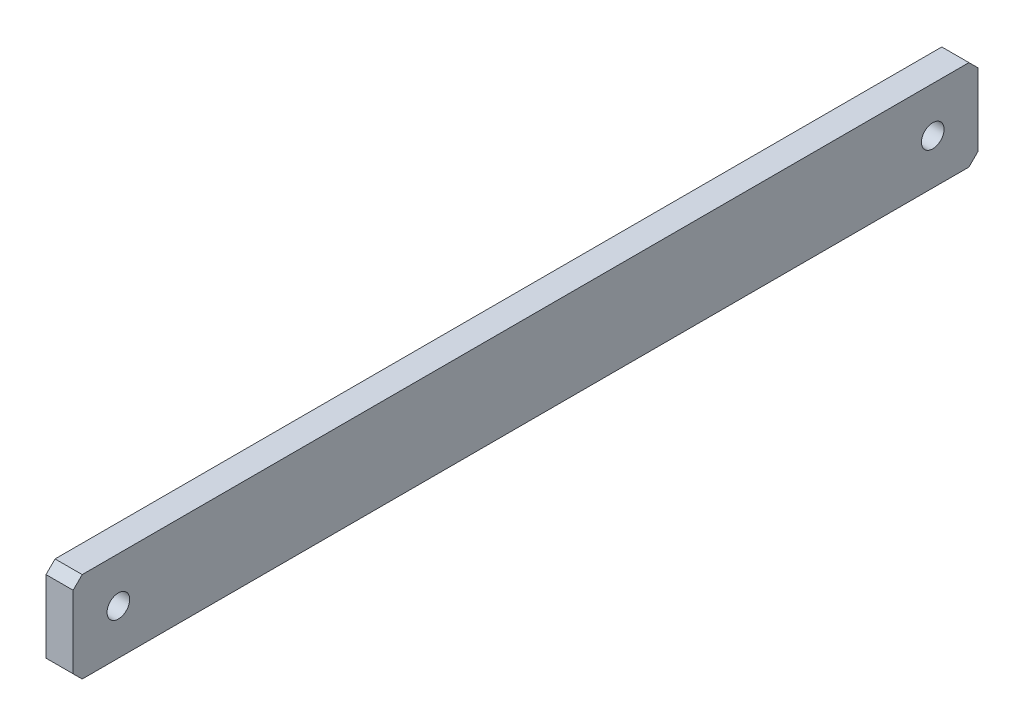
ISO-10303-21;
HEADER;
FILE_DESCRIPTION(('STEP AP214'),'2;1');
FILE_NAME('part.step','',(''),(''),'','','');
FILE_SCHEMA(('AUTOMOTIVE_DESIGN { 1 0 10303 214 1 1 1 1 }'));
ENDSEC;
DATA;
#1=APPLICATION_CONTEXT('core data for automotive mechanical design processes');
#2=APPLICATION_PROTOCOL_DEFINITION('international standard','automotive_design',2000,#1);
#3=PRODUCT_CONTEXT('',#1,'mechanical');
#4=PRODUCT('Part','Part','',(#3));
#5=PRODUCT_RELATED_PRODUCT_CATEGORY('part','',(#4));
#6=PRODUCT_DEFINITION_FORMATION('','',#4);
#7=PRODUCT_DEFINITION_CONTEXT('part definition',#1,'design');
#8=PRODUCT_DEFINITION('design','',#6,#7);
#9=PRODUCT_DEFINITION_SHAPE('','',#8);
#10=(LENGTH_UNIT() NAMED_UNIT(*) SI_UNIT(.MILLI.,.METRE.));
#11=(NAMED_UNIT(*) PLANE_ANGLE_UNIT() SI_UNIT($,.RADIAN.));
#12=(NAMED_UNIT(*) SI_UNIT($,.STERADIAN.) SOLID_ANGLE_UNIT());
#13=UNCERTAINTY_MEASURE_WITH_UNIT(LENGTH_MEASURE(1.E-05),#10,'distance_accuracy_value','');
#14=(GEOMETRIC_REPRESENTATION_CONTEXT(3) GLOBAL_UNCERTAINTY_ASSIGNED_CONTEXT((#13)) GLOBAL_UNIT_ASSIGNED_CONTEXT((#10,
#11,#12)) REPRESENTATION_CONTEXT('',''));
#15=CARTESIAN_POINT('',(0.,0.,0.));
#16=DIRECTION('',(0.,0.,1.));
#17=DIRECTION('',(1.,0.,0.));
#18=AXIS2_PLACEMENT_3D('',#15,#16,#17);
#19=CARTESIAN_POINT('',(3.,-5.00000000000001,50.));
#20=DIRECTION('',(0.,0.,-1.));
#21=DIRECTION('',(-1.,0.,0.));
#22=AXIS2_PLACEMENT_3D('',#19,#20,#21);
#23=PLANE('',#22);
#24=DIRECTION('',(0.,-1.,0.));
#25=VECTOR('',#24,1.);
#26=CARTESIAN_POINT('',(0.,-5.00000000000001,50.));
#27=LINE('',#26,#25);
#28=CARTESIAN_POINT('',(0.,4.00000000000001,50.));
#29=VERTEX_POINT('',#28);
#30=CARTESIAN_POINT('',(0.,-4.00000000000001,50.));
#31=VERTEX_POINT('',#30);
#32=EDGE_CURVE('E141',#29,#31,#27,.T.);
#33=ORIENTED_EDGE('',*,*,#32,.T.);
#34=DIRECTION('',(1.,0.,0.));
#35=VECTOR('',#34,1.);
#36=CARTESIAN_POINT('',(3.,-4.00000000000001,50.));
#37=LINE('',#36,#35);
#38=CARTESIAN_POINT('',(3.,-4.00000000000001,50.));
#39=VERTEX_POINT('',#38);
#40=EDGE_CURVE('E11',#31,#39,#37,.T.);
#41=ORIENTED_EDGE('',*,*,#40,.T.);
#42=DIRECTION('',(0.,-1.,0.));
#43=VECTOR('',#42,1.);
#44=CARTESIAN_POINT('',(3.,-5.00000000000001,50.));
#45=LINE('',#44,#43);
#46=CARTESIAN_POINT('',(3.,4.00000000000001,50.));
#47=VERTEX_POINT('',#46);
#48=EDGE_CURVE('E139',#47,#39,#45,.T.);
#49=ORIENTED_EDGE('',*,*,#48,.F.);
#50=DIRECTION('',(-1.,0.,0.));
#51=VECTOR('',#50,1.);
#52=CARTESIAN_POINT('',(3.,4.00000000000001,50.));
#53=LINE('',#52,#51);
#54=EDGE_CURVE('E48',#47,#29,#53,.T.);
#55=ORIENTED_EDGE('',*,*,#54,.T.);
#56=EDGE_LOOP('',(#33,#41,#49,#55));
#57=FACE_BOUND('',#56,.T.);
#58=ADVANCED_FACE('F39',(#57),#23,.F.);
#59=CARTESIAN_POINT('',(3.,-4.99999999999999,-50.));
#60=DIRECTION('',(0.,1.,0.));
#61=DIRECTION('',(0.,0.,1.));
#62=AXIS2_PLACEMENT_3D('',#59,#60,#61);
#63=PLANE('',#62);
#64=DIRECTION('',(0.,0.,-1.));
#65=VECTOR('',#64,1.);
#66=CARTESIAN_POINT('',(0.,-4.99999999999999,-50.));
#67=LINE('',#66,#65);
#68=CARTESIAN_POINT('',(0.,-5.00000000000001,49.));
#69=VERTEX_POINT('',#68);
#70=CARTESIAN_POINT('',(0.,-4.99999999999999,-49.));
#71=VERTEX_POINT('',#70);
#72=EDGE_CURVE('E135',#69,#71,#67,.T.);
#73=ORIENTED_EDGE('',*,*,#72,.T.);
#74=DIRECTION('',(1.,0.,0.));
#75=VECTOR('',#74,1.);
#76=CARTESIAN_POINT('',(3.,-4.99999999999999,-49.));
#77=LINE('',#76,#75);
#78=CARTESIAN_POINT('',(3.,-4.99999999999999,-49.));
#79=VERTEX_POINT('',#78);
#80=EDGE_CURVE('E111',#71,#79,#77,.T.);
#81=ORIENTED_EDGE('',*,*,#80,.T.);
#82=DIRECTION('',(0.,0.,-1.));
#83=VECTOR('',#82,1.);
#84=CARTESIAN_POINT('',(3.,-4.99999999999999,-50.));
#85=LINE('',#84,#83);
#86=CARTESIAN_POINT('',(3.,-5.00000000000001,49.));
#87=VERTEX_POINT('',#86);
#88=EDGE_CURVE('E198',#87,#79,#85,.T.);
#89=ORIENTED_EDGE('',*,*,#88,.F.);
#90=DIRECTION('',(-1.,0.,0.));
#91=VECTOR('',#90,1.);
#92=CARTESIAN_POINT('',(3.,-5.00000000000001,49.));
#93=LINE('',#92,#91);
#94=EDGE_CURVE('E117',#87,#69,#93,.T.);
#95=ORIENTED_EDGE('',*,*,#94,.T.);
#96=EDGE_LOOP('',(#73,#81,#89,#95));
#97=FACE_BOUND('',#96,.T.);
#98=ADVANCED_FACE('F228',(#97),#63,.F.);
#99=CARTESIAN_POINT('',(3.,-4.99999999999999,-50.));
#100=DIRECTION('',(0.,0.,1.));
#101=DIRECTION('',(1.,0.,0.));
#102=AXIS2_PLACEMENT_3D('',#99,#100,#101);
#103=PLANE('',#102);
#104=DIRECTION('',(0.,1.,0.));
#105=VECTOR('',#104,1.);
#106=CARTESIAN_POINT('',(3.,-4.99999999999999,-50.));
#107=LINE('',#106,#105);
#108=CARTESIAN_POINT('',(3.,-4.00000000000001,-50.));
#109=VERTEX_POINT('',#108);
#110=CARTESIAN_POINT('',(3.,4.,-50.));
#111=VERTEX_POINT('',#110);
#112=EDGE_CURVE('E126',#109,#111,#107,.T.);
#113=ORIENTED_EDGE('',*,*,#112,.F.);
#114=DIRECTION('',(-1.,0.,0.));
#115=VECTOR('',#114,1.);
#116=CARTESIAN_POINT('',(3.,-4.00000000000001,-50.));
#117=LINE('',#116,#115);
#118=CARTESIAN_POINT('',(0.,-4.00000000000001,-50.));
#119=VERTEX_POINT('',#118);
#120=EDGE_CURVE('E110',#109,#119,#117,.T.);
#121=ORIENTED_EDGE('',*,*,#120,.T.);
#122=DIRECTION('',(0.,1.,0.));
#123=VECTOR('',#122,1.);
#124=CARTESIAN_POINT('',(0.,-4.99999999999999,-50.));
#125=LINE('',#124,#123);
#126=CARTESIAN_POINT('',(0.,4.,-50.));
#127=VERTEX_POINT('',#126);
#128=EDGE_CURVE('E124',#119,#127,#125,.T.);
#129=ORIENTED_EDGE('',*,*,#128,.T.);
#130=DIRECTION('',(1.,0.,0.));
#131=VECTOR('',#130,1.);
#132=CARTESIAN_POINT('',(3.,4.,-50.));
#133=LINE('',#132,#131);
#134=EDGE_CURVE('E129',#127,#111,#133,.T.);
#135=ORIENTED_EDGE('',*,*,#134,.T.);
#136=EDGE_LOOP('',(#113,#121,#129,#135));
#137=FACE_BOUND('',#136,.T.);
#138=ADVANCED_FACE('F123',(#137),#103,.F.);
#139=CARTESIAN_POINT('',(3.,5.00000000000001,-50.));
#140=DIRECTION('',(0.,-1.,0.));
#141=DIRECTION('',(0.,0.,-1.));
#142=AXIS2_PLACEMENT_3D('',#139,#140,#141);
#143=PLANE('',#142);
#144=DIRECTION('',(0.,0.,1.));
#145=VECTOR('',#144,1.);
#146=CARTESIAN_POINT('',(3.,5.00000000000001,-50.));
#147=LINE('',#146,#145);
#148=CARTESIAN_POINT('',(3.,5.00000000000001,-49.));
#149=VERTEX_POINT('',#148);
#150=CARTESIAN_POINT('',(3.,4.99999999999999,49.));
#151=VERTEX_POINT('',#150);
#152=EDGE_CURVE('E146',#149,#151,#147,.T.);
#153=ORIENTED_EDGE('',*,*,#152,.F.);
#154=DIRECTION('',(-1.,0.,0.));
#155=VECTOR('',#154,1.);
#156=CARTESIAN_POINT('',(3.,5.00000000000001,-49.));
#157=LINE('',#156,#155);
#158=CARTESIAN_POINT('',(0.,5.00000000000001,-49.));
#159=VERTEX_POINT('',#158);
#160=EDGE_CURVE('E173',#149,#159,#157,.T.);
#161=ORIENTED_EDGE('',*,*,#160,.T.);
#162=DIRECTION('',(0.,0.,1.));
#163=VECTOR('',#162,1.);
#164=CARTESIAN_POINT('',(0.,5.00000000000001,-50.));
#165=LINE('',#164,#163);
#166=CARTESIAN_POINT('',(0.,4.99999999999999,49.));
#167=VERTEX_POINT('',#166);
#168=EDGE_CURVE('E134',#159,#167,#165,.T.);
#169=ORIENTED_EDGE('',*,*,#168,.T.);
#170=DIRECTION('',(1.,0.,0.));
#171=VECTOR('',#170,1.);
#172=CARTESIAN_POINT('',(3.,4.99999999999999,49.));
#173=LINE('',#172,#171);
#174=EDGE_CURVE('E55',#167,#151,#173,.T.);
#175=ORIENTED_EDGE('',*,*,#174,.T.);
#176=EDGE_LOOP('',(#153,#161,#169,#175));
#177=FACE_BOUND('',#176,.T.);
#178=ADVANCED_FACE('F221',(#177),#143,.F.);
#179=CARTESIAN_POINT('',(3.,0.,0.));
#180=DIRECTION('',(1.,0.,0.));
#181=DIRECTION('',(0.,0.,-1.));
#182=AXIS2_PLACEMENT_3D('',#179,#180,#181);
#183=PLANE('',#182);
#184=CARTESIAN_POINT('',(3.,0.,45.));
#185=DIRECTION('',(1.,0.,0.));
#186=DIRECTION('',(0.,0.,-1.));
#187=AXIS2_PLACEMENT_3D('',#184,#185,#186);
#188=CIRCLE('',#187,1.25);
#189=CARTESIAN_POINT('',(3.,0.,43.75));
#190=VERTEX_POINT('',#189);
#191=EDGE_CURVE('E191',#190,#190,#188,.T.);
#192=ORIENTED_EDGE('',*,*,#191,.F.);
#193=EDGE_LOOP('',(#192));
#194=FACE_BOUND('',#193,.T.);
#195=CARTESIAN_POINT('',(3.,0.,-45.));
#196=DIRECTION('',(1.,0.,0.));
#197=DIRECTION('',(0.,0.,-1.));
#198=AXIS2_PLACEMENT_3D('',#195,#196,#197);
#199=CIRCLE('',#198,1.25);
#200=CARTESIAN_POINT('',(3.,0.,-46.25));
#201=VERTEX_POINT('',#200);
#202=EDGE_CURVE('E204',#201,#201,#199,.T.);
#203=ORIENTED_EDGE('',*,*,#202,.F.);
#204=EDGE_LOOP('',(#203));
#205=FACE_BOUND('',#204,.T.);
#206=ORIENTED_EDGE('',*,*,#88,.T.);
#207=DIRECTION('',(0.,-0.707106781186543,0.707106781186552));
#208=VECTOR('',#207,1.);
#209=CARTESIAN_POINT('',(3.,-27.,-26.9999999999996));
#210=LINE('',#209,#208);
#211=EDGE_CURVE('E168',#79,#109,#210,.F.);
#212=ORIENTED_EDGE('',*,*,#211,.T.);
#213=ORIENTED_EDGE('',*,*,#112,.T.);
#214=DIRECTION('',(0.,-0.707106781186553,-0.707106781186542));
#215=VECTOR('',#214,1.);
#216=CARTESIAN_POINT('',(3.,27.,-27.0000000000004));
#217=LINE('',#216,#215);
#218=EDGE_CURVE('E62',#111,#149,#217,.F.);
#219=ORIENTED_EDGE('',*,*,#218,.T.);
#220=ORIENTED_EDGE('',*,*,#152,.T.);
#221=DIRECTION('',(0.,0.707106781186543,-0.707106781186552));
#222=VECTOR('',#221,1.);
#223=CARTESIAN_POINT('',(3.,27.,26.9999999999997));
#224=LINE('',#223,#222);
#225=EDGE_CURVE('E160',#151,#47,#224,.F.);
#226=ORIENTED_EDGE('',*,*,#225,.T.);
#227=ORIENTED_EDGE('',*,*,#48,.T.);
#228=DIRECTION('',(0.,0.707106781186552,0.707106781186543));
#229=VECTOR('',#228,1.);
#230=CARTESIAN_POINT('',(3.,-27.,27.0000000000004));
#231=LINE('',#230,#229);
#232=EDGE_CURVE('E163',#39,#87,#231,.F.);
#233=ORIENTED_EDGE('',*,*,#232,.T.);
#234=EDGE_LOOP('',(#206,#212,#213,#219,#220,#226,#227,#233));
#235=FACE_BOUND('',#234,.T.);
#236=ADVANCED_FACE('F218',(#194,#205,#235),#183,.T.);
#237=CARTESIAN_POINT('',(0.,0.,0.));
#238=DIRECTION('',(1.,0.,0.));
#239=DIRECTION('',(0.,0.,-1.));
#240=AXIS2_PLACEMENT_3D('',#237,#238,#239);
#241=PLANE('',#240);
#242=CARTESIAN_POINT('',(0.,0.,45.));
#243=DIRECTION('',(1.,0.,0.));
#244=DIRECTION('',(0.,0.,-1.));
#245=AXIS2_PLACEMENT_3D('',#242,#243,#244);
#246=CIRCLE('',#245,1.25);
#247=CARTESIAN_POINT('',(0.,0.,43.75));
#248=VERTEX_POINT('',#247);
#249=EDGE_CURVE('E188',#248,#248,#246,.T.);
#250=ORIENTED_EDGE('',*,*,#249,.T.);
#251=EDGE_LOOP('',(#250));
#252=FACE_BOUND('',#251,.T.);
#253=CARTESIAN_POINT('',(0.,0.,-45.));
#254=DIRECTION('',(1.,0.,0.));
#255=DIRECTION('',(0.,0.,-1.));
#256=AXIS2_PLACEMENT_3D('',#253,#254,#255);
#257=CIRCLE('',#256,1.25);
#258=CARTESIAN_POINT('',(0.,0.,-46.25));
#259=VERTEX_POINT('',#258);
#260=EDGE_CURVE('E208',#259,#259,#257,.T.);
#261=ORIENTED_EDGE('',*,*,#260,.T.);
#262=EDGE_LOOP('',(#261));
#263=FACE_BOUND('',#262,.T.);
#264=ORIENTED_EDGE('',*,*,#128,.F.);
#265=DIRECTION('',(0.,0.707106781186543,-0.707106781186552));
#266=VECTOR('',#265,1.);
#267=CARTESIAN_POINT('',(0.,-4.00000000000001,-50.));
#268=LINE('',#267,#266);
#269=EDGE_CURVE('E106',#119,#71,#268,.F.);
#270=ORIENTED_EDGE('',*,*,#269,.T.);
#271=ORIENTED_EDGE('',*,*,#72,.F.);
#272=DIRECTION('',(0.,-0.707106781186552,-0.707106781186543));
#273=VECTOR('',#272,1.);
#274=CARTESIAN_POINT('',(0.,-5.00000000000001,49.));
#275=LINE('',#274,#273);
#276=EDGE_CURVE('E150',#69,#31,#275,.F.);
#277=ORIENTED_EDGE('',*,*,#276,.T.);
#278=ORIENTED_EDGE('',*,*,#32,.F.);
#279=DIRECTION('',(0.,-0.707106781186543,0.707106781186552));
#280=VECTOR('',#279,1.);
#281=CARTESIAN_POINT('',(0.,4.00000000000001,50.));
#282=LINE('',#281,#280);
#283=EDGE_CURVE('E128',#29,#167,#282,.F.);
#284=ORIENTED_EDGE('',*,*,#283,.T.);
#285=ORIENTED_EDGE('',*,*,#168,.F.);
#286=DIRECTION('',(0.,0.707106781186553,0.707106781186542));
#287=VECTOR('',#286,1.);
#288=CARTESIAN_POINT('',(0.,5.00000000000001,-49.));
#289=LINE('',#288,#287);
#290=EDGE_CURVE('E118',#159,#127,#289,.F.);
#291=ORIENTED_EDGE('',*,*,#290,.T.);
#292=EDGE_LOOP('',(#264,#270,#271,#277,#278,#284,#285,#291));
#293=FACE_BOUND('',#292,.T.);
#294=ADVANCED_FACE('F131',(#252,#263,#293),#241,.F.);
#295=CARTESIAN_POINT('',(0.,0.,-45.));
#296=DIRECTION('',(1.,0.,0.));
#297=DIRECTION('',(0.,0.,-1.));
#298=AXIS2_PLACEMENT_3D('',#295,#296,#297);
#299=CYLINDRICAL_SURFACE('',#298,1.25);
#300=ORIENTED_EDGE('',*,*,#260,.F.);
#301=EDGE_LOOP('',(#300));
#302=FACE_BOUND('',#301,.T.);
#303=ORIENTED_EDGE('',*,*,#202,.T.);
#304=EDGE_LOOP('',(#303));
#305=FACE_BOUND('',#304,.T.);
#306=ADVANCED_FACE('F258',(#302,#305),#299,.F.);
#307=CARTESIAN_POINT('',(0.,0.,45.));
#308=DIRECTION('',(1.,0.,0.));
#309=DIRECTION('',(0.,0.,-1.));
#310=AXIS2_PLACEMENT_3D('',#307,#308,#309);
#311=CYLINDRICAL_SURFACE('',#310,1.25);
#312=ORIENTED_EDGE('',*,*,#249,.F.);
#313=EDGE_LOOP('',(#312));
#314=FACE_BOUND('',#313,.T.);
#315=ORIENTED_EDGE('',*,*,#191,.T.);
#316=EDGE_LOOP('',(#315));
#317=FACE_BOUND('',#316,.T.);
#318=ADVANCED_FACE('F216',(#314,#317),#311,.F.);
#319=CARTESIAN_POINT('',(3.,-4.00000000000001,-50.));
#320=DIRECTION('',(0.,0.707106781186552,0.707106781186543));
#321=DIRECTION('',(-1.,0.,0.));
#322=AXIS2_PLACEMENT_3D('',#319,#320,#321);
#323=PLANE('',#322);
#324=ORIENTED_EDGE('',*,*,#211,.F.);
#325=ORIENTED_EDGE('',*,*,#80,.F.);
#326=ORIENTED_EDGE('',*,*,#269,.F.);
#327=ORIENTED_EDGE('',*,*,#120,.F.);
#328=EDGE_LOOP('',(#324,#325,#326,#327));
#329=FACE_BOUND('',#328,.T.);
#330=ADVANCED_FACE('F109',(#329),#323,.F.);
#331=CARTESIAN_POINT('',(3.,5.00000000000001,-49.));
#332=DIRECTION('',(0.,-0.707106781186542,0.707106781186553));
#333=DIRECTION('',(-1.,0.,0.));
#334=AXIS2_PLACEMENT_3D('',#331,#332,#333);
#335=PLANE('',#334);
#336=ORIENTED_EDGE('',*,*,#218,.F.);
#337=ORIENTED_EDGE('',*,*,#134,.F.);
#338=ORIENTED_EDGE('',*,*,#290,.F.);
#339=ORIENTED_EDGE('',*,*,#160,.F.);
#340=EDGE_LOOP('',(#336,#337,#338,#339));
#341=FACE_BOUND('',#340,.T.);
#342=ADVANCED_FACE('F235',(#341),#335,.F.);
#343=CARTESIAN_POINT('',(3.,-5.00000000000001,49.));
#344=DIRECTION('',(0.,0.707106781186543,-0.707106781186552));
#345=DIRECTION('',(-1.,0.,0.));
#346=AXIS2_PLACEMENT_3D('',#343,#344,#345);
#347=PLANE('',#346);
#348=ORIENTED_EDGE('',*,*,#232,.F.);
#349=ORIENTED_EDGE('',*,*,#40,.F.);
#350=ORIENTED_EDGE('',*,*,#276,.F.);
#351=ORIENTED_EDGE('',*,*,#94,.F.);
#352=EDGE_LOOP('',(#348,#349,#350,#351));
#353=FACE_BOUND('',#352,.T.);
#354=ADVANCED_FACE('F230',(#353),#347,.F.);
#355=CARTESIAN_POINT('',(3.,4.00000000000001,50.));
#356=DIRECTION('',(0.,-0.707106781186552,-0.707106781186543));
#357=DIRECTION('',(-1.,0.,0.));
#358=AXIS2_PLACEMENT_3D('',#355,#356,#357);
#359=PLANE('',#358);
#360=ORIENTED_EDGE('',*,*,#225,.F.);
#361=ORIENTED_EDGE('',*,*,#174,.F.);
#362=ORIENTED_EDGE('',*,*,#283,.F.);
#363=ORIENTED_EDGE('',*,*,#54,.F.);
#364=EDGE_LOOP('',(#360,#361,#362,#363));
#365=FACE_BOUND('',#364,.T.);
#366=ADVANCED_FACE('F41',(#365),#359,.F.);
#367=CLOSED_SHELL('',(#58,#98,#138,#178,#236,#294,#306,#318,#330,#342,#354,#366));
#368=MANIFOLD_SOLID_BREP('B2',#367);
#369=ADVANCED_BREP_SHAPE_REPRESENTATION('',(#18,#368),#14);
#370=SHAPE_DEFINITION_REPRESENTATION(#9,#369);
ENDSEC;
END-ISO-10303-21;
